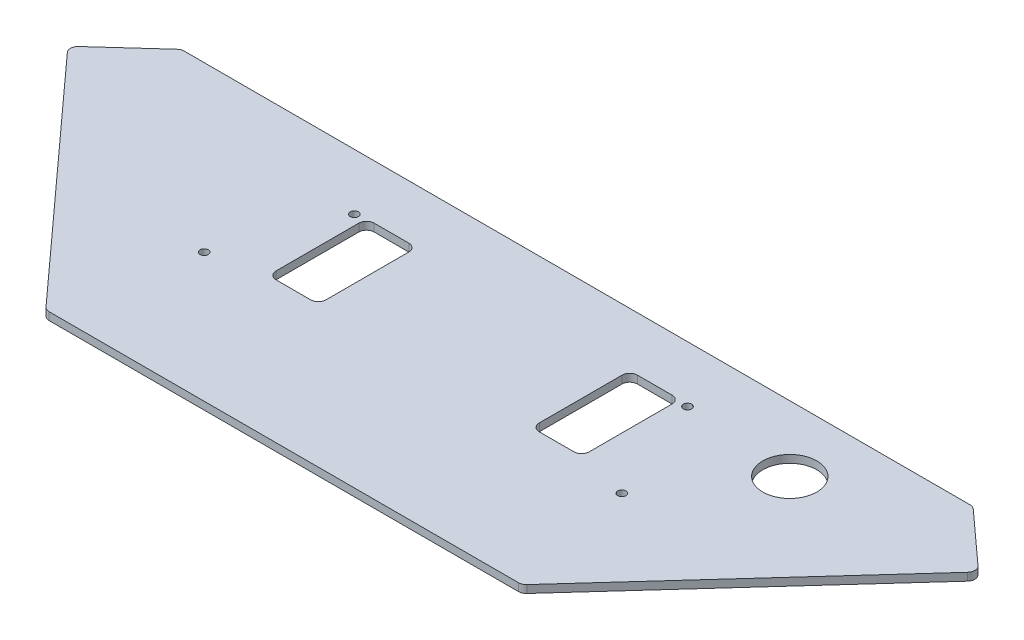
ISO-10303-21;
HEADER;
FILE_DESCRIPTION(('STEP AP214'),'2;1');
FILE_NAME('part.step','',(''),(''),'','','');
FILE_SCHEMA(('AUTOMOTIVE_DESIGN { 1 0 10303 214 1 1 1 1 }'));
ENDSEC;
DATA;
#1=APPLICATION_CONTEXT('core data for automotive mechanical design processes');
#2=APPLICATION_PROTOCOL_DEFINITION('international standard','automotive_design',2000,#1);
#3=PRODUCT_CONTEXT('',#1,'mechanical');
#4=PRODUCT('Part','Part','',(#3));
#5=PRODUCT_RELATED_PRODUCT_CATEGORY('part','',(#4));
#6=PRODUCT_DEFINITION_FORMATION('','',#4);
#7=PRODUCT_DEFINITION_CONTEXT('part definition',#1,'design');
#8=PRODUCT_DEFINITION('design','',#6,#7);
#9=PRODUCT_DEFINITION_SHAPE('','',#8);
#10=(LENGTH_UNIT() NAMED_UNIT(*) SI_UNIT(.MILLI.,.METRE.));
#11=(NAMED_UNIT(*) PLANE_ANGLE_UNIT() SI_UNIT($,.RADIAN.));
#12=(NAMED_UNIT(*) SI_UNIT($,.STERADIAN.) SOLID_ANGLE_UNIT());
#13=UNCERTAINTY_MEASURE_WITH_UNIT(LENGTH_MEASURE(1.E-05),#10,'distance_accuracy_value','');
#14=(GEOMETRIC_REPRESENTATION_CONTEXT(3) GLOBAL_UNCERTAINTY_ASSIGNED_CONTEXT((#13)) GLOBAL_UNIT_ASSIGNED_CONTEXT((#10,
#11,#12)) REPRESENTATION_CONTEXT('',''));
#15=CARTESIAN_POINT('',(0.,0.,0.));
#16=DIRECTION('',(0.,0.,1.));
#17=DIRECTION('',(1.,0.,0.));
#18=AXIS2_PLACEMENT_3D('',#15,#16,#17);
#19=CARTESIAN_POINT('',(-187.336709329558,3.175,-98.4569812393423));
#20=DIRECTION('',(0.740452782676817,0.,-0.672108381606834));
#21=DIRECTION('',(-0.672108381606834,0.,-0.740452782676817));
#22=AXIS2_PLACEMENT_3D('',#19,#20,#21);
#23=PLANE('',#22);
#24=DIRECTION('',(0.672108381606835,0.,0.740452782676817));
#25=VECTOR('',#24,1.);
#26=CARTESIAN_POINT('',(-187.336709329558,3.175,-98.4569812393423));
#27=LINE('',#26,#25);
#28=CARTESIAN_POINT('',(-185.202765217956,3.175,-96.1060436543434));
#29=VERTEX_POINT('',#28);
#30=CARTESIAN_POINT('',(-98.9123540402718,3.175,-1.04105588839828));
#31=VERTEX_POINT('',#30);
#32=EDGE_CURVE('E417',#29,#31,#27,.T.);
#33=ORIENTED_EDGE('',*,*,#32,.F.);
#34=DIRECTION('',(0.,-1.,0.));
#35=VECTOR('',#34,1.);
#36=CARTESIAN_POINT('',(-185.202765217956,3.175,-96.1060436543434));
#37=LINE('',#36,#35);
#38=CARTESIAN_POINT('',(-185.202765217956,0.,-96.1060436543434));
#39=VERTEX_POINT('',#38);
#40=EDGE_CURVE('E464',#29,#39,#37,.T.);
#41=ORIENTED_EDGE('',*,*,#40,.T.);
#42=DIRECTION('',(0.672108381606835,0.,0.740452782676817));
#43=VECTOR('',#42,1.);
#44=CARTESIAN_POINT('',(-187.336709329558,0.,-98.4569812393423));
#45=LINE('',#44,#43);
#46=CARTESIAN_POINT('',(-98.9123540402718,0.,-1.04105588839828));
#47=VERTEX_POINT('',#46);
#48=EDGE_CURVE('E312',#39,#47,#45,.T.);
#49=ORIENTED_EDGE('',*,*,#48,.T.);
#50=DIRECTION('',(0.,-1.,0.));
#51=VECTOR('',#50,1.);
#52=CARTESIAN_POINT('',(-98.9123540402718,3.175,-1.04105588839828));
#53=LINE('',#52,#51);
#54=EDGE_CURVE('E440',#47,#31,#53,.F.);
#55=ORIENTED_EDGE('',*,*,#54,.T.);
#56=EDGE_LOOP('',(#33,#41,#49,#55));
#57=FACE_BOUND('',#56,.T.);
#58=ADVANCED_FACE('F39',(#57),#23,.F.);
#59=CARTESIAN_POINT('',(-97.9673884669315,3.175,0.));
#60=DIRECTION('',(0.,0.,-1.));
#61=DIRECTION('',(-1.,0.,0.));
#62=AXIS2_PLACEMENT_3D('',#59,#60,#61);
#63=PLANE('',#62);
#64=DIRECTION('',(1.,0.,0.));
#65=VECTOR('',#64,1.);
#66=CARTESIAN_POINT('',(-97.9673884669315,0.,0.));
#67=LINE('',#66,#65);
#68=CARTESIAN_POINT('',(-96.5614164552729,0.,0.));
#69=VERTEX_POINT('',#68);
#70=CARTESIAN_POINT('',(96.5614164552729,0.,0.));
#71=VERTEX_POINT('',#70);
#72=EDGE_CURVE('E444',#69,#71,#67,.T.);
#73=ORIENTED_EDGE('',*,*,#72,.T.);
#74=DIRECTION('',(0.,-1.,0.));
#75=VECTOR('',#74,1.);
#76=CARTESIAN_POINT('',(96.5614164552729,3.175,0.));
#77=LINE('',#76,#75);
#78=CARTESIAN_POINT('',(96.5614164552729,3.175,0.));
#79=VERTEX_POINT('',#78);
#80=EDGE_CURVE('E11',#71,#79,#77,.F.);
#81=ORIENTED_EDGE('',*,*,#80,.T.);
#82=DIRECTION('',(1.,0.,0.));
#83=VECTOR('',#82,1.);
#84=CARTESIAN_POINT('',(-97.9673884669315,3.175,0.));
#85=LINE('',#84,#83);
#86=CARTESIAN_POINT('',(-96.5614164552729,3.175,0.));
#87=VERTEX_POINT('',#86);
#88=EDGE_CURVE('E421',#87,#79,#85,.T.);
#89=ORIENTED_EDGE('',*,*,#88,.F.);
#90=DIRECTION('',(0.,-1.,0.));
#91=VECTOR('',#90,1.);
#92=CARTESIAN_POINT('',(-96.5614164552729,3.175,0.));
#93=LINE('',#92,#91);
#94=EDGE_CURVE('E48',#87,#69,#93,.T.);
#95=ORIENTED_EDGE('',*,*,#94,.T.);
#96=EDGE_LOOP('',(#73,#81,#89,#95));
#97=FACE_BOUND('',#96,.T.);
#98=ADVANCED_FACE('F535',(#97),#63,.F.);
#99=CARTESIAN_POINT('',(97.9673884669315,3.175,0.));
#100=DIRECTION('',(-0.740452782676817,0.,-0.672108381606834));
#101=DIRECTION('',(-0.672108381606834,0.,0.740452782676817));
#102=AXIS2_PLACEMENT_3D('',#99,#100,#101);
#103=PLANE('',#102);
#104=DIRECTION('',(0.672108381606835,0.,-0.740452782676817));
#105=VECTOR('',#104,1.);
#106=CARTESIAN_POINT('',(97.9673884669315,0.,0.));
#107=LINE('',#106,#105);
#108=CARTESIAN_POINT('',(98.9123540402718,0.,-1.0410558883983));
#109=VERTEX_POINT('',#108);
#110=CARTESIAN_POINT('',(185.202765217956,0.,-96.1060436543434));
#111=VERTEX_POINT('',#110);
#112=EDGE_CURVE('E448',#109,#111,#107,.T.);
#113=ORIENTED_EDGE('',*,*,#112,.T.);
#114=DIRECTION('',(0.,-1.,0.));
#115=VECTOR('',#114,1.);
#116=CARTESIAN_POINT('',(185.202765217956,3.175,-96.1060436543434));
#117=LINE('',#116,#115);
#118=CARTESIAN_POINT('',(185.202765217956,3.175,-96.1060436543434));
#119=VERTEX_POINT('',#118);
#120=EDGE_CURVE('E527',#111,#119,#117,.F.);
#121=ORIENTED_EDGE('',*,*,#120,.T.);
#122=DIRECTION('',(0.672108381606835,0.,-0.740452782676817));
#123=VECTOR('',#122,1.);
#124=CARTESIAN_POINT('',(97.9673884669315,3.175,0.));
#125=LINE('',#124,#123);
#126=CARTESIAN_POINT('',(98.9123540402718,3.175,-1.0410558883983));
#127=VERTEX_POINT('',#126);
#128=EDGE_CURVE('E426',#127,#119,#125,.T.);
#129=ORIENTED_EDGE('',*,*,#128,.F.);
#130=DIRECTION('',(0.,-1.,0.));
#131=VECTOR('',#130,1.);
#132=CARTESIAN_POINT('',(98.9123540402718,3.175,-1.0410558883983));
#133=LINE('',#132,#131);
#134=EDGE_CURVE('E523',#127,#109,#133,.T.);
#135=ORIENTED_EDGE('',*,*,#134,.T.);
#136=EDGE_LOOP('',(#113,#121,#129,#135));
#137=FACE_BOUND('',#136,.T.);
#138=ADVANCED_FACE('F548',(#137),#103,.F.);
#139=CARTESIAN_POINT('',(187.336709329558,3.175,-98.4569812393423));
#140=DIRECTION('',(-0.672108381606835,0.,0.740452782676817));
#141=DIRECTION('',(0.740452782676817,0.,0.672108381606835));
#142=AXIS2_PLACEMENT_3D('',#139,#140,#141);
#143=PLANE('',#142);
#144=DIRECTION('',(-0.740452782676817,0.,-0.672108381606835));
#145=VECTOR('',#144,1.);
#146=CARTESIAN_POINT('',(187.336709329558,0.,-98.4569812393423));
#147=LINE('',#146,#145);
#148=CARTESIAN_POINT('',(184.985771744559,0.,-100.590925350944));
#149=VERTEX_POINT('',#148);
#150=CARTESIAN_POINT('',(163.794816947241,0.,-119.825937584999));
#151=VERTEX_POINT('',#150);
#152=EDGE_CURVE('E452',#149,#151,#147,.T.);
#153=ORIENTED_EDGE('',*,*,#152,.T.);
#154=DIRECTION('',(0.,-1.,0.));
#155=VECTOR('',#154,1.);
#156=CARTESIAN_POINT('',(163.794816947241,3.175,-119.825937584999));
#157=LINE('',#156,#155);
#158=CARTESIAN_POINT('',(163.794816947241,3.175,-119.825937584999));
#159=VERTEX_POINT('',#158);
#160=EDGE_CURVE('E520',#151,#159,#157,.F.);
#161=ORIENTED_EDGE('',*,*,#160,.T.);
#162=DIRECTION('',(-0.740452782676817,0.,-0.672108381606835));
#163=VECTOR('',#162,1.);
#164=CARTESIAN_POINT('',(187.336709329558,3.175,-98.4569812393423));
#165=LINE('',#164,#163);
#166=CARTESIAN_POINT('',(184.985771744559,3.175,-100.590925350944));
#167=VERTEX_POINT('',#166);
#168=EDGE_CURVE('E430',#167,#159,#165,.T.);
#169=ORIENTED_EDGE('',*,*,#168,.F.);
#170=DIRECTION('',(0.,-1.,0.));
#171=VECTOR('',#170,1.);
#172=CARTESIAN_POINT('',(184.985771744559,3.175,-100.590925350944));
#173=LINE('',#172,#171);
#174=EDGE_CURVE('E516',#167,#149,#173,.T.);
#175=ORIENTED_EDGE('',*,*,#174,.T.);
#176=EDGE_LOOP('',(#153,#161,#169,#175));
#177=FACE_BOUND('',#176,.T.);
#178=ADVANCED_FACE('F558',(#177),#143,.F.);
#179=CARTESIAN_POINT('',(162.886958445569,3.175,-120.65));
#180=DIRECTION('',(0.,0.,1.));
#181=DIRECTION('',(1.,0.,0.));
#182=AXIS2_PLACEMENT_3D('',#179,#180,#181);
#183=PLANE('',#182);
#184=DIRECTION('',(-1.,0.,0.));
#185=VECTOR('',#184,1.);
#186=CARTESIAN_POINT('',(162.886958445569,0.,-120.65));
#187=LINE('',#186,#185);
#188=CARTESIAN_POINT('',(161.66087283564,0.,-120.65));
#189=VERTEX_POINT('',#188);
#190=CARTESIAN_POINT('',(-161.66087283564,0.,-120.65));
#191=VERTEX_POINT('',#190);
#192=EDGE_CURVE('E456',#189,#191,#187,.T.);
#193=ORIENTED_EDGE('',*,*,#192,.T.);
#194=DIRECTION('',(0.,-1.,0.));
#195=VECTOR('',#194,1.);
#196=CARTESIAN_POINT('',(-161.66087283564,3.175,-120.65));
#197=LINE('',#196,#195);
#198=CARTESIAN_POINT('',(-161.66087283564,3.175,-120.65));
#199=VERTEX_POINT('',#198);
#200=EDGE_CURVE('E55',#191,#199,#197,.F.);
#201=ORIENTED_EDGE('',*,*,#200,.T.);
#202=DIRECTION('',(-1.,0.,0.));
#203=VECTOR('',#202,1.);
#204=CARTESIAN_POINT('',(162.886958445569,3.175,-120.65));
#205=LINE('',#204,#203);
#206=CARTESIAN_POINT('',(161.66087283564,3.175,-120.65));
#207=VERTEX_POINT('',#206);
#208=EDGE_CURVE('E433',#207,#199,#205,.T.);
#209=ORIENTED_EDGE('',*,*,#208,.F.);
#210=DIRECTION('',(0.,-1.,0.));
#211=VECTOR('',#210,1.);
#212=CARTESIAN_POINT('',(161.66087283564,3.175,-120.65));
#213=LINE('',#212,#211);
#214=EDGE_CURVE('E510',#207,#189,#213,.T.);
#215=ORIENTED_EDGE('',*,*,#214,.T.);
#216=EDGE_LOOP('',(#193,#201,#209,#215));
#217=FACE_BOUND('',#216,.T.);
#218=ADVANCED_FACE('F564',(#217),#183,.F.);
#219=CARTESIAN_POINT('',(-187.336709329558,3.175,-98.4569812393423));
#220=DIRECTION('',(0.672108381606835,0.,0.740452782676817));
#221=DIRECTION('',(0.740452782676817,0.,-0.672108381606835));
#222=AXIS2_PLACEMENT_3D('',#219,#220,#221);
#223=PLANE('',#222);
#224=DIRECTION('',(-0.740452782676817,0.,0.672108381606835));
#225=VECTOR('',#224,1.);
#226=CARTESIAN_POINT('',(-187.336709329558,0.,-98.4569812393423));
#227=LINE('',#226,#225);
#228=CARTESIAN_POINT('',(-163.794816947241,0.,-119.825937584999));
#229=VERTEX_POINT('',#228);
#230=CARTESIAN_POINT('',(-184.985771744559,0.,-100.590925350944));
#231=VERTEX_POINT('',#230);
#232=EDGE_CURVE('E422',#229,#231,#227,.T.);
#233=ORIENTED_EDGE('',*,*,#232,.T.);
#234=DIRECTION('',(0.,-1.,0.));
#235=VECTOR('',#234,1.);
#236=CARTESIAN_POINT('',(-184.985771744559,3.175,-100.590925350944));
#237=LINE('',#236,#235);
#238=CARTESIAN_POINT('',(-184.985771744559,3.175,-100.590925350944));
#239=VERTEX_POINT('',#238);
#240=EDGE_CURVE('E490',#231,#239,#237,.F.);
#241=ORIENTED_EDGE('',*,*,#240,.T.);
#242=DIRECTION('',(-0.740452782676817,0.,0.672108381606835));
#243=VECTOR('',#242,1.);
#244=CARTESIAN_POINT('',(-187.336709329558,3.175,-98.4569812393423));
#245=LINE('',#244,#243);
#246=CARTESIAN_POINT('',(-163.794816947241,3.175,-119.825937584999));
#247=VERTEX_POINT('',#246);
#248=EDGE_CURVE('E436',#247,#239,#245,.T.);
#249=ORIENTED_EDGE('',*,*,#248,.F.);
#250=DIRECTION('',(0.,-1.,0.));
#251=VECTOR('',#250,1.);
#252=CARTESIAN_POINT('',(-163.794816947241,3.175,-119.825937584999));
#253=LINE('',#252,#251);
#254=EDGE_CURVE('E486',#247,#229,#253,.T.);
#255=ORIENTED_EDGE('',*,*,#254,.T.);
#256=EDGE_LOOP('',(#233,#241,#249,#255));
#257=FACE_BOUND('',#256,.T.);
#258=ADVANCED_FACE('F572',(#257),#223,.F.);
#259=CARTESIAN_POINT('',(0.,3.175,0.));
#260=DIRECTION('',(0.,1.,0.));
#261=DIRECTION('',(0.,0.,1.));
#262=AXIS2_PLACEMENT_3D('',#259,#260,#261);
#263=PLANE('',#262);
#264=CARTESIAN_POINT('',(114.4778,3.175,-93.6625));
#265=DIRECTION('',(0.,1.,0.));
#266=DIRECTION('',(0.,0.,1.));
#267=AXIS2_PLACEMENT_3D('',#264,#265,#266);
#268=CIRCLE('',#267,11.1125);
#269=CARTESIAN_POINT('',(114.4778,3.175,-82.5499999999999));
#270=VERTEX_POINT('',#269);
#271=EDGE_CURVE('E915',#270,#270,#268,.T.);
#272=ORIENTED_EDGE('',*,*,#271,.F.);
#273=EDGE_LOOP('',(#272));
#274=FACE_BOUND('',#273,.T.);
#275=CARTESIAN_POINT('',(-68.5292,3.175,-97.5359999999999));
#276=DIRECTION('',(0.,1.,0.));
#277=DIRECTION('',(0.,0.,-1.));
#278=AXIS2_PLACEMENT_3D('',#275,#276,#277);
#279=CIRCLE('',#278,1.7018);
#280=CARTESIAN_POINT('',(-68.5292,3.175,-99.2378));
#281=VERTEX_POINT('',#280);
#282=EDGE_CURVE('E905',#281,#281,#279,.T.);
#283=ORIENTED_EDGE('',*,*,#282,.F.);
#284=EDGE_LOOP('',(#283));
#285=FACE_BOUND('',#284,.T.);
#286=CARTESIAN_POINT('',(-85.9282,3.175,-53.1114));
#287=DIRECTION('',(0.,1.,0.));
#288=DIRECTION('',(0.,0.,-1.));
#289=AXIS2_PLACEMENT_3D('',#286,#287,#288);
#290=CIRCLE('',#289,1.7018);
#291=CARTESIAN_POINT('',(-85.9282,3.175,-54.8132));
#292=VERTEX_POINT('',#291);
#293=EDGE_CURVE('E912',#292,#292,#290,.T.);
#294=ORIENTED_EDGE('',*,*,#293,.F.);
#295=EDGE_LOOP('',(#294));
#296=FACE_BOUND('',#295,.T.);
#297=CARTESIAN_POINT('',(85.9282,3.175,-53.1114));
#298=DIRECTION('',(0.,1.,0.));
#299=DIRECTION('',(0.,0.,1.));
#300=AXIS2_PLACEMENT_3D('',#297,#298,#299);
#301=CIRCLE('',#300,1.7018);
#302=CARTESIAN_POINT('',(85.9282,3.175,-51.4096));
#303=VERTEX_POINT('',#302);
#304=EDGE_CURVE('E930',#303,#303,#301,.T.);
#305=ORIENTED_EDGE('',*,*,#304,.F.);
#306=EDGE_LOOP('',(#305));
#307=FACE_BOUND('',#306,.T.);
#308=CARTESIAN_POINT('',(68.5292,3.175,-97.536));
#309=DIRECTION('',(0.,1.,0.));
#310=DIRECTION('',(0.,0.,1.));
#311=AXIS2_PLACEMENT_3D('',#308,#309,#310);
#312=CIRCLE('',#311,1.7018);
#313=CARTESIAN_POINT('',(68.5292,3.175,-95.8342));
#314=VERTEX_POINT('',#313);
#315=EDGE_CURVE('E920',#314,#314,#312,.T.);
#316=ORIENTED_EDGE('',*,*,#315,.F.);
#317=EDGE_LOOP('',(#316));
#318=FACE_BOUND('',#317,.T.);
#319=CARTESIAN_POINT('',(47.0408,3.175,-95.25));
#320=DIRECTION('',(0.,1.,0.));
#321=DIRECTION('',(0.,0.,-1.));
#322=AXIS2_PLACEMENT_3D('',#319,#320,#321);
#323=CIRCLE('',#322,3.175);
#324=CARTESIAN_POINT('',(47.0408,3.175,-98.425));
#325=VERTEX_POINT('',#324);
#326=CARTESIAN_POINT('',(43.8658,3.175,-95.25));
#327=VERTEX_POINT('',#326);
#328=EDGE_CURVE('E233',#325,#327,#323,.T.);
#329=ORIENTED_EDGE('',*,*,#328,.F.);
#330=DIRECTION('',(-1.,0.,0.));
#331=VECTOR('',#330,1.);
#332=CARTESIAN_POINT('',(61.2648,3.175,-98.425));
#333=LINE('',#332,#331);
#334=CARTESIAN_POINT('',(61.2648,3.175,-98.425));
#335=VERTEX_POINT('',#334);
#336=EDGE_CURVE('E255',#335,#325,#333,.T.);
#337=ORIENTED_EDGE('',*,*,#336,.F.);
#338=CARTESIAN_POINT('',(61.2648,3.175,-95.25));
#339=DIRECTION('',(0.,1.,0.));
#340=DIRECTION('',(0.,0.,-1.));
#341=AXIS2_PLACEMENT_3D('',#338,#339,#340);
#342=CIRCLE('',#341,3.175);
#343=CARTESIAN_POINT('',(64.4398,3.175,-95.25));
#344=VERTEX_POINT('',#343);
#345=EDGE_CURVE('E259',#344,#335,#342,.T.);
#346=ORIENTED_EDGE('',*,*,#345,.F.);
#347=DIRECTION('',(0.,0.,-1.));
#348=VECTOR('',#347,1.);
#349=CARTESIAN_POINT('',(64.4398,3.175,-61.214));
#350=LINE('',#349,#348);
#351=CARTESIAN_POINT('',(64.4398,3.175,-61.214));
#352=VERTEX_POINT('',#351);
#353=EDGE_CURVE('E302',#352,#344,#350,.T.);
#354=ORIENTED_EDGE('',*,*,#353,.F.);
#355=CARTESIAN_POINT('',(61.2648,3.175,-61.214));
#356=DIRECTION('',(0.,1.,0.));
#357=DIRECTION('',(0.,0.,-1.));
#358=AXIS2_PLACEMENT_3D('',#355,#356,#357);
#359=CIRCLE('',#358,3.175);
#360=CARTESIAN_POINT('',(61.2648,3.175,-58.039));
#361=VERTEX_POINT('',#360);
#362=EDGE_CURVE('E298',#361,#352,#359,.T.);
#363=ORIENTED_EDGE('',*,*,#362,.F.);
#364=DIRECTION('',(1.,0.,0.));
#365=VECTOR('',#364,1.);
#366=CARTESIAN_POINT('',(61.2648,3.175,-58.039));
#367=LINE('',#366,#365);
#368=CARTESIAN_POINT('',(47.0408,3.175,-58.039));
#369=VERTEX_POINT('',#368);
#370=EDGE_CURVE('E294',#369,#361,#367,.T.);
#371=ORIENTED_EDGE('',*,*,#370,.F.);
#372=CARTESIAN_POINT('',(47.0408,3.175,-61.214));
#373=DIRECTION('',(0.,1.,0.));
#374=DIRECTION('',(0.,0.,1.));
#375=AXIS2_PLACEMENT_3D('',#372,#373,#374);
#376=CIRCLE('',#375,3.175);
#377=CARTESIAN_POINT('',(43.8658,3.175,-61.214));
#378=VERTEX_POINT('',#377);
#379=EDGE_CURVE('E290',#378,#369,#376,.T.);
#380=ORIENTED_EDGE('',*,*,#379,.F.);
#381=DIRECTION('',(0.,0.,1.));
#382=VECTOR('',#381,1.);
#383=CARTESIAN_POINT('',(43.8658,3.175,-61.214));
#384=LINE('',#383,#382);
#385=EDGE_CURVE('E286',#327,#378,#384,.T.);
#386=ORIENTED_EDGE('',*,*,#385,.F.);
#387=EDGE_LOOP('',(#329,#337,#346,#354,#363,#371,#380,#386));
#388=FACE_BOUND('',#387,.T.);
#389=CARTESIAN_POINT('',(-61.2648,3.175,-61.214));
#390=DIRECTION('',(0.,1.,0.));
#391=DIRECTION('',(0.,0.,-1.));
#392=AXIS2_PLACEMENT_3D('',#389,#390,#391);
#393=CIRCLE('',#392,3.175);
#394=CARTESIAN_POINT('',(-64.4398,3.175,-61.214));
#395=VERTEX_POINT('',#394);
#396=CARTESIAN_POINT('',(-61.2648,3.175,-58.039));
#397=VERTEX_POINT('',#396);
#398=EDGE_CURVE('E364',#395,#397,#393,.T.);
#399=ORIENTED_EDGE('',*,*,#398,.F.);
#400=DIRECTION('',(0.,0.,1.));
#401=VECTOR('',#400,1.);
#402=CARTESIAN_POINT('',(-64.4398,3.175,-61.214));
#403=LINE('',#402,#401);
#404=CARTESIAN_POINT('',(-64.4398,3.175,-95.25));
#405=VERTEX_POINT('',#404);
#406=EDGE_CURVE('E335',#405,#395,#403,.T.);
#407=ORIENTED_EDGE('',*,*,#406,.F.);
#408=CARTESIAN_POINT('',(-61.2648,3.175,-95.25));
#409=DIRECTION('',(0.,1.,0.));
#410=DIRECTION('',(0.,0.,-1.));
#411=AXIS2_PLACEMENT_3D('',#408,#409,#410);
#412=CIRCLE('',#411,3.175);
#413=CARTESIAN_POINT('',(-61.2648,3.175,-98.425));
#414=VERTEX_POINT('',#413);
#415=EDGE_CURVE('E387',#414,#405,#412,.T.);
#416=ORIENTED_EDGE('',*,*,#415,.F.);
#417=DIRECTION('',(-1.,0.,0.));
#418=VECTOR('',#417,1.);
#419=CARTESIAN_POINT('',(-61.2648,3.175,-98.425));
#420=LINE('',#419,#418);
#421=CARTESIAN_POINT('',(-47.0408,3.175,-98.425));
#422=VERTEX_POINT('',#421);
#423=EDGE_CURVE('E383',#422,#414,#420,.T.);
#424=ORIENTED_EDGE('',*,*,#423,.F.);
#425=CARTESIAN_POINT('',(-47.0408,3.175,-95.25));
#426=DIRECTION('',(0.,1.,0.));
#427=DIRECTION('',(0.,0.,-1.));
#428=AXIS2_PLACEMENT_3D('',#425,#426,#427);
#429=CIRCLE('',#428,3.175);
#430=CARTESIAN_POINT('',(-43.8658,3.175,-95.25));
#431=VERTEX_POINT('',#430);
#432=EDGE_CURVE('E379',#431,#422,#429,.T.);
#433=ORIENTED_EDGE('',*,*,#432,.F.);
#434=DIRECTION('',(0.,0.,-1.));
#435=VECTOR('',#434,1.);
#436=CARTESIAN_POINT('',(-43.8658,3.175,-61.214));
#437=LINE('',#436,#435);
#438=CARTESIAN_POINT('',(-43.8658,3.175,-61.214));
#439=VERTEX_POINT('',#438);
#440=EDGE_CURVE('E375',#439,#431,#437,.T.);
#441=ORIENTED_EDGE('',*,*,#440,.F.);
#442=CARTESIAN_POINT('',(-47.0408,3.175,-61.214));
#443=DIRECTION('',(0.,1.,0.));
#444=DIRECTION('',(0.,0.,1.));
#445=AXIS2_PLACEMENT_3D('',#442,#443,#444);
#446=CIRCLE('',#445,3.175);
#447=CARTESIAN_POINT('',(-47.0408,3.175,-58.039));
#448=VERTEX_POINT('',#447);
#449=EDGE_CURVE('E371',#448,#439,#446,.T.);
#450=ORIENTED_EDGE('',*,*,#449,.F.);
#451=DIRECTION('',(1.,0.,0.));
#452=VECTOR('',#451,1.);
#453=CARTESIAN_POINT('',(-61.2648,3.175,-58.039));
#454=LINE('',#453,#452);
#455=EDGE_CURVE('E367',#397,#448,#454,.T.);
#456=ORIENTED_EDGE('',*,*,#455,.F.);
#457=EDGE_LOOP('',(#399,#407,#416,#424,#433,#441,#450,#456));
#458=FACE_BOUND('',#457,.T.);
#459=ORIENTED_EDGE('',*,*,#248,.T.);
#460=CARTESIAN_POINT('',(-182.851827632957,3.175,-98.2399877659451));
#461=DIRECTION('',(0.,1.,0.));
#462=DIRECTION('',(0.,0.,1.));
#463=AXIS2_PLACEMENT_3D('',#460,#461,#462);
#464=CIRCLE('',#463,3.175);
#465=EDGE_CURVE('E507',#239,#29,#464,.T.);
#466=ORIENTED_EDGE('',*,*,#465,.T.);
#467=ORIENTED_EDGE('',*,*,#32,.T.);
#468=CARTESIAN_POINT('',(-96.5614164552729,3.175,-3.175));
#469=DIRECTION('',(0.,1.,0.));
#470=DIRECTION('',(0.,0.,1.));
#471=AXIS2_PLACEMENT_3D('',#468,#469,#470);
#472=CIRCLE('',#471,3.175);
#473=EDGE_CURVE('E493',#31,#87,#472,.T.);
#474=ORIENTED_EDGE('',*,*,#473,.T.);
#475=ORIENTED_EDGE('',*,*,#88,.T.);
#476=CARTESIAN_POINT('',(96.5614164552729,3.175,-3.175));
#477=DIRECTION('',(0.,1.,0.));
#478=DIRECTION('',(0.,0.,1.));
#479=AXIS2_PLACEMENT_3D('',#476,#477,#478);
#480=CIRCLE('',#479,3.175);
#481=EDGE_CURVE('E496',#79,#127,#480,.T.);
#482=ORIENTED_EDGE('',*,*,#481,.T.);
#483=ORIENTED_EDGE('',*,*,#128,.T.);
#484=CARTESIAN_POINT('',(182.851827632957,3.175,-98.2399877659451));
#485=DIRECTION('',(0.,1.,0.));
#486=DIRECTION('',(0.,0.,1.));
#487=AXIS2_PLACEMENT_3D('',#484,#485,#486);
#488=CIRCLE('',#487,3.175);
#489=EDGE_CURVE('E499',#119,#167,#488,.T.);
#490=ORIENTED_EDGE('',*,*,#489,.T.);
#491=ORIENTED_EDGE('',*,*,#168,.T.);
#492=CARTESIAN_POINT('',(161.66087283564,3.175,-117.475));
#493=DIRECTION('',(0.,1.,0.));
#494=DIRECTION('',(0.,0.,1.));
#495=AXIS2_PLACEMENT_3D('',#492,#493,#494);
#496=CIRCLE('',#495,3.175);
#497=EDGE_CURVE('E62',#159,#207,#496,.T.);
#498=ORIENTED_EDGE('',*,*,#497,.T.);
#499=ORIENTED_EDGE('',*,*,#208,.T.);
#500=CARTESIAN_POINT('',(-161.66087283564,3.175,-117.475));
#501=DIRECTION('',(0.,1.,0.));
#502=DIRECTION('',(0.,0.,1.));
#503=AXIS2_PLACEMENT_3D('',#500,#501,#502);
#504=CIRCLE('',#503,3.175);
#505=EDGE_CURVE('E504',#199,#247,#504,.T.);
#506=ORIENTED_EDGE('',*,*,#505,.T.);
#507=EDGE_LOOP('',(#459,#466,#467,#474,#475,#482,#483,#490,#491,#498,#499,#506));
#508=FACE_BOUND('',#507,.T.);
#509=ADVANCED_FACE('F551',(#274,#285,#296,#307,#318,#388,#458,#508),#263,.T.);
#510=CARTESIAN_POINT('',(0.,0.,0.));
#511=DIRECTION('',(0.,1.,0.));
#512=DIRECTION('',(0.,0.,1.));
#513=AXIS2_PLACEMENT_3D('',#510,#511,#512);
#514=PLANE('',#513);
#515=CARTESIAN_POINT('',(114.4778,0.,-93.6625));
#516=DIRECTION('',(0.,1.,0.));
#517=DIRECTION('',(0.,0.,1.));
#518=AXIS2_PLACEMENT_3D('',#515,#516,#517);
#519=CIRCLE('',#518,11.1125);
#520=CARTESIAN_POINT('',(114.4778,0.,-82.5499999999999));
#521=VERTEX_POINT('',#520);
#522=EDGE_CURVE('E908',#521,#521,#519,.T.);
#523=ORIENTED_EDGE('',*,*,#522,.T.);
#524=EDGE_LOOP('',(#523));
#525=FACE_BOUND('',#524,.T.);
#526=CARTESIAN_POINT('',(-68.5292,0.,-97.5359999999999));
#527=DIRECTION('',(0.,1.,0.));
#528=DIRECTION('',(0.,0.,1.));
#529=AXIS2_PLACEMENT_3D('',#526,#527,#528);
#530=CIRCLE('',#529,1.7018);
#531=CARTESIAN_POINT('',(-68.5292,0.,-95.8341999999999));
#532=VERTEX_POINT('',#531);
#533=EDGE_CURVE('E902',#532,#532,#530,.F.);
#534=ORIENTED_EDGE('',*,*,#533,.F.);
#535=EDGE_LOOP('',(#534));
#536=FACE_BOUND('',#535,.T.);
#537=CARTESIAN_POINT('',(-85.9282,0.,-53.1114));
#538=DIRECTION('',(0.,1.,0.));
#539=DIRECTION('',(0.,0.,1.));
#540=AXIS2_PLACEMENT_3D('',#537,#538,#539);
#541=CIRCLE('',#540,1.7018);
#542=CARTESIAN_POINT('',(-85.9282,0.,-51.4096));
#543=VERTEX_POINT('',#542);
#544=EDGE_CURVE('E918',#543,#543,#541,.F.);
#545=ORIENTED_EDGE('',*,*,#544,.F.);
#546=EDGE_LOOP('',(#545));
#547=FACE_BOUND('',#546,.T.);
#548=CARTESIAN_POINT('',(85.9282,0.,-53.1114));
#549=DIRECTION('',(0.,1.,0.));
#550=DIRECTION('',(0.,0.,1.));
#551=AXIS2_PLACEMENT_3D('',#548,#549,#550);
#552=CIRCLE('',#551,1.7018);
#553=CARTESIAN_POINT('',(85.9282,0.,-51.4096));
#554=VERTEX_POINT('',#553);
#555=EDGE_CURVE('E923',#554,#554,#552,.F.);
#556=ORIENTED_EDGE('',*,*,#555,.F.);
#557=EDGE_LOOP('',(#556));
#558=FACE_BOUND('',#557,.T.);
#559=CARTESIAN_POINT('',(68.5292,0.,-97.536));
#560=DIRECTION('',(0.,1.,0.));
#561=DIRECTION('',(0.,0.,1.));
#562=AXIS2_PLACEMENT_3D('',#559,#560,#561);
#563=CIRCLE('',#562,1.7018);
#564=CARTESIAN_POINT('',(68.5292,0.,-95.8342));
#565=VERTEX_POINT('',#564);
#566=EDGE_CURVE('E262',#565,#565,#563,.F.);
#567=ORIENTED_EDGE('',*,*,#566,.F.);
#568=EDGE_LOOP('',(#567));
#569=FACE_BOUND('',#568,.T.);
#570=DIRECTION('',(-1.,0.,0.));
#571=VECTOR('',#570,1.);
#572=CARTESIAN_POINT('',(61.2648,0.,-98.425));
#573=LINE('',#572,#571);
#574=CARTESIAN_POINT('',(61.2648,0.,-98.425));
#575=VERTEX_POINT('',#574);
#576=CARTESIAN_POINT('',(47.0408,0.,-98.425));
#577=VERTEX_POINT('',#576);
#578=EDGE_CURVE('E239',#575,#577,#573,.T.);
#579=ORIENTED_EDGE('',*,*,#578,.T.);
#580=CARTESIAN_POINT('',(47.0408,0.,-95.25));
#581=DIRECTION('',(0.,1.,0.));
#582=DIRECTION('',(0.,0.,-1.));
#583=AXIS2_PLACEMENT_3D('',#580,#581,#582);
#584=CIRCLE('',#583,3.175);
#585=CARTESIAN_POINT('',(43.8658,0.,-95.25));
#586=VERTEX_POINT('',#585);
#587=EDGE_CURVE('E230',#577,#586,#584,.T.);
#588=ORIENTED_EDGE('',*,*,#587,.T.);
#589=DIRECTION('',(0.,0.,1.));
#590=VECTOR('',#589,1.);
#591=CARTESIAN_POINT('',(43.8658,0.,-61.214));
#592=LINE('',#591,#590);
#593=CARTESIAN_POINT('',(43.8658,0.,-61.214));
#594=VERTEX_POINT('',#593);
#595=EDGE_CURVE('E243',#586,#594,#592,.T.);
#596=ORIENTED_EDGE('',*,*,#595,.T.);
#597=CARTESIAN_POINT('',(47.0408,0.,-61.214));
#598=DIRECTION('',(0.,1.,0.));
#599=DIRECTION('',(0.,0.,1.));
#600=AXIS2_PLACEMENT_3D('',#597,#598,#599);
#601=CIRCLE('',#600,3.175);
#602=CARTESIAN_POINT('',(47.0408,0.,-58.039));
#603=VERTEX_POINT('',#602);
#604=EDGE_CURVE('E248',#594,#603,#601,.T.);
#605=ORIENTED_EDGE('',*,*,#604,.T.);
#606=DIRECTION('',(1.,0.,0.));
#607=VECTOR('',#606,1.);
#608=CARTESIAN_POINT('',(61.2648,0.,-58.039));
#609=LINE('',#608,#607);
#610=CARTESIAN_POINT('',(61.2648,0.,-58.039));
#611=VERTEX_POINT('',#610);
#612=EDGE_CURVE('E267',#603,#611,#609,.T.);
#613=ORIENTED_EDGE('',*,*,#612,.T.);
#614=CARTESIAN_POINT('',(61.2648,0.,-61.214));
#615=DIRECTION('',(0.,1.,0.));
#616=DIRECTION('',(0.,0.,-1.));
#617=AXIS2_PLACEMENT_3D('',#614,#615,#616);
#618=CIRCLE('',#617,3.175);
#619=CARTESIAN_POINT('',(64.4398,0.,-61.214));
#620=VERTEX_POINT('',#619);
#621=EDGE_CURVE('E271',#611,#620,#618,.T.);
#622=ORIENTED_EDGE('',*,*,#621,.T.);
#623=DIRECTION('',(0.,0.,-1.));
#624=VECTOR('',#623,1.);
#625=CARTESIAN_POINT('',(64.4398,0.,-61.214));
#626=LINE('',#625,#624);
#627=CARTESIAN_POINT('',(64.4398,0.,-95.25));
#628=VERTEX_POINT('',#627);
#629=EDGE_CURVE('E275',#620,#628,#626,.T.);
#630=ORIENTED_EDGE('',*,*,#629,.T.);
#631=CARTESIAN_POINT('',(61.2648,0.,-95.25));
#632=DIRECTION('',(0.,1.,0.));
#633=DIRECTION('',(0.,0.,-1.));
#634=AXIS2_PLACEMENT_3D('',#631,#632,#633);
#635=CIRCLE('',#634,3.175);
#636=EDGE_CURVE('E279',#628,#575,#635,.T.);
#637=ORIENTED_EDGE('',*,*,#636,.T.);
#638=EDGE_LOOP('',(#579,#588,#596,#605,#613,#622,#630,#637));
#639=FACE_BOUND('',#638,.T.);
#640=DIRECTION('',(0.,0.,1.));
#641=VECTOR('',#640,1.);
#642=CARTESIAN_POINT('',(-64.4398,0.,-61.214));
#643=LINE('',#642,#641);
#644=CARTESIAN_POINT('',(-64.4398,0.,-95.25));
#645=VERTEX_POINT('',#644);
#646=CARTESIAN_POINT('',(-64.4398,0.,-61.214));
#647=VERTEX_POINT('',#646);
#648=EDGE_CURVE('E359',#645,#647,#643,.T.);
#649=ORIENTED_EDGE('',*,*,#648,.T.);
#650=CARTESIAN_POINT('',(-61.2648,0.,-61.214));
#651=DIRECTION('',(0.,1.,0.));
#652=DIRECTION('',(0.,0.,-1.));
#653=AXIS2_PLACEMENT_3D('',#650,#651,#652);
#654=CIRCLE('',#653,3.175);
#655=CARTESIAN_POINT('',(-61.2648,0.,-58.039));
#656=VERTEX_POINT('',#655);
#657=EDGE_CURVE('E330',#647,#656,#654,.T.);
#658=ORIENTED_EDGE('',*,*,#657,.T.);
#659=DIRECTION('',(1.,0.,0.));
#660=VECTOR('',#659,1.);
#661=CARTESIAN_POINT('',(-61.2648,0.,-58.039));
#662=LINE('',#661,#660);
#663=CARTESIAN_POINT('',(-47.0408,0.,-58.039));
#664=VERTEX_POINT('',#663);
#665=EDGE_CURVE('E334',#656,#664,#662,.T.);
#666=ORIENTED_EDGE('',*,*,#665,.T.);
#667=CARTESIAN_POINT('',(-47.0408,0.,-61.214));
#668=DIRECTION('',(0.,1.,0.));
#669=DIRECTION('',(0.,0.,1.));
#670=AXIS2_PLACEMENT_3D('',#667,#668,#669);
#671=CIRCLE('',#670,3.175);
#672=CARTESIAN_POINT('',(-43.8658,0.,-61.214));
#673=VERTEX_POINT('',#672);
#674=EDGE_CURVE('E339',#664,#673,#671,.T.);
#675=ORIENTED_EDGE('',*,*,#674,.T.);
#676=DIRECTION('',(0.,0.,-1.));
#677=VECTOR('',#676,1.);
#678=CARTESIAN_POINT('',(-43.8658,0.,-61.214));
#679=LINE('',#678,#677);
#680=CARTESIAN_POINT('',(-43.8658,0.,-95.25));
#681=VERTEX_POINT('',#680);
#682=EDGE_CURVE('E343',#673,#681,#679,.T.);
#683=ORIENTED_EDGE('',*,*,#682,.T.);
#684=CARTESIAN_POINT('',(-47.0408,0.,-95.25));
#685=DIRECTION('',(0.,1.,0.));
#686=DIRECTION('',(0.,0.,-1.));
#687=AXIS2_PLACEMENT_3D('',#684,#685,#686);
#688=CIRCLE('',#687,3.175);
#689=CARTESIAN_POINT('',(-47.0408,0.,-98.425));
#690=VERTEX_POINT('',#689);
#691=EDGE_CURVE('E347',#681,#690,#688,.T.);
#692=ORIENTED_EDGE('',*,*,#691,.T.);
#693=DIRECTION('',(-1.,0.,0.));
#694=VECTOR('',#693,1.);
#695=CARTESIAN_POINT('',(-61.2648,0.,-98.425));
#696=LINE('',#695,#694);
#697=CARTESIAN_POINT('',(-61.2648,0.,-98.425));
#698=VERTEX_POINT('',#697);
#699=EDGE_CURVE('E351',#690,#698,#696,.T.);
#700=ORIENTED_EDGE('',*,*,#699,.T.);
#701=CARTESIAN_POINT('',(-61.2648,0.,-95.25));
#702=DIRECTION('',(0.,1.,0.));
#703=DIRECTION('',(0.,0.,-1.));
#704=AXIS2_PLACEMENT_3D('',#701,#702,#703);
#705=CIRCLE('',#704,3.175);
#706=EDGE_CURVE('E355',#698,#645,#705,.T.);
#707=ORIENTED_EDGE('',*,*,#706,.T.);
#708=EDGE_LOOP('',(#649,#658,#666,#675,#683,#692,#700,#707));
#709=FACE_BOUND('',#708,.T.);
#710=ORIENTED_EDGE('',*,*,#48,.F.);
#711=CARTESIAN_POINT('',(-182.851827632957,0.,-98.2399877659451));
#712=DIRECTION('',(0.,1.,0.));
#713=DIRECTION('',(0.,0.,1.));
#714=AXIS2_PLACEMENT_3D('',#711,#712,#713);
#715=CIRCLE('',#714,3.175);
#716=EDGE_CURVE('E483',#39,#231,#715,.F.);
#717=ORIENTED_EDGE('',*,*,#716,.T.);
#718=ORIENTED_EDGE('',*,*,#232,.F.);
#719=CARTESIAN_POINT('',(-161.66087283564,0.,-117.475));
#720=DIRECTION('',(0.,1.,0.));
#721=DIRECTION('',(0.,0.,1.));
#722=AXIS2_PLACEMENT_3D('',#719,#720,#721);
#723=CIRCLE('',#722,3.175);
#724=EDGE_CURVE('E480',#229,#191,#723,.F.);
#725=ORIENTED_EDGE('',*,*,#724,.T.);
#726=ORIENTED_EDGE('',*,*,#192,.F.);
#727=CARTESIAN_POINT('',(161.66087283564,0.,-117.475));
#728=DIRECTION('',(0.,1.,0.));
#729=DIRECTION('',(0.,0.,1.));
#730=AXIS2_PLACEMENT_3D('',#727,#728,#729);
#731=CIRCLE('',#730,3.175);
#732=EDGE_CURVE('E477',#189,#151,#731,.F.);
#733=ORIENTED_EDGE('',*,*,#732,.T.);
#734=ORIENTED_EDGE('',*,*,#152,.F.);
#735=CARTESIAN_POINT('',(182.851827632957,0.,-98.2399877659451));
#736=DIRECTION('',(0.,1.,0.));
#737=DIRECTION('',(0.,0.,1.));
#738=AXIS2_PLACEMENT_3D('',#735,#736,#737);
#739=CIRCLE('',#738,3.175);
#740=EDGE_CURVE('E474',#149,#111,#739,.F.);
#741=ORIENTED_EDGE('',*,*,#740,.T.);
#742=ORIENTED_EDGE('',*,*,#112,.F.);
#743=CARTESIAN_POINT('',(96.5614164552729,0.,-3.175));
#744=DIRECTION('',(0.,1.,0.));
#745=DIRECTION('',(0.,0.,1.));
#746=AXIS2_PLACEMENT_3D('',#743,#744,#745);
#747=CIRCLE('',#746,3.175);
#748=EDGE_CURVE('E471',#109,#71,#747,.F.);
#749=ORIENTED_EDGE('',*,*,#748,.T.);
#750=ORIENTED_EDGE('',*,*,#72,.F.);
#751=CARTESIAN_POINT('',(-96.5614164552729,0.,-3.175));
#752=DIRECTION('',(0.,1.,0.));
#753=DIRECTION('',(0.,0.,1.));
#754=AXIS2_PLACEMENT_3D('',#751,#752,#753);
#755=CIRCLE('',#754,3.175);
#756=EDGE_CURVE('E468',#69,#47,#755,.F.);
#757=ORIENTED_EDGE('',*,*,#756,.T.);
#758=EDGE_LOOP('',(#710,#717,#718,#725,#726,#733,#734,#741,#742,#749,#750,#757));
#759=FACE_BOUND('',#758,.T.);
#760=ADVANCED_FACE('F250',(#525,#536,#547,#558,#569,#639,#709,#759),#514,.F.);
#761=CARTESIAN_POINT('',(-61.2648,0.,-61.214));
#762=DIRECTION('',(0.,1.,0.));
#763=DIRECTION('',(0.,0.,1.));
#764=AXIS2_PLACEMENT_3D('',#761,#762,#763);
#765=CYLINDRICAL_SURFACE('',#764,3.175);
#766=ORIENTED_EDGE('',*,*,#398,.T.);
#767=DIRECTION('',(0.,1.,0.));
#768=VECTOR('',#767,1.);
#769=CARTESIAN_POINT('',(-61.2648,0.,-58.039));
#770=LINE('',#769,#768);
#771=EDGE_CURVE('E363',#656,#397,#770,.T.);
#772=ORIENTED_EDGE('',*,*,#771,.F.);
#773=ORIENTED_EDGE('',*,*,#657,.F.);
#774=DIRECTION('',(0.,1.,0.));
#775=VECTOR('',#774,1.);
#776=CARTESIAN_POINT('',(-64.4398,0.,-61.214));
#777=LINE('',#776,#775);
#778=EDGE_CURVE('E287',#647,#395,#777,.T.);
#779=ORIENTED_EDGE('',*,*,#778,.T.);
#780=EDGE_LOOP('',(#766,#772,#773,#779));
#781=FACE_BOUND('',#780,.T.);
#782=ADVANCED_FACE('F638',(#781),#765,.F.);
#783=CARTESIAN_POINT('',(-64.4398,0.,-61.214));
#784=DIRECTION('',(-1.,0.,0.));
#785=DIRECTION('',(0.,0.,1.));
#786=AXIS2_PLACEMENT_3D('',#783,#784,#785);
#787=PLANE('',#786);
#788=ORIENTED_EDGE('',*,*,#406,.T.);
#789=ORIENTED_EDGE('',*,*,#778,.F.);
#790=ORIENTED_EDGE('',*,*,#648,.F.);
#791=DIRECTION('',(0.,1.,0.));
#792=VECTOR('',#791,1.);
#793=CARTESIAN_POINT('',(-64.4398,0.,-95.25));
#794=LINE('',#793,#792);
#795=EDGE_CURVE('E396',#645,#405,#794,.T.);
#796=ORIENTED_EDGE('',*,*,#795,.T.);
#797=EDGE_LOOP('',(#788,#789,#790,#796));
#798=FACE_BOUND('',#797,.T.);
#799=ADVANCED_FACE('F653',(#798),#787,.F.);
#800=CARTESIAN_POINT('',(-61.2648,0.,-95.25));
#801=DIRECTION('',(0.,1.,0.));
#802=DIRECTION('',(0.,0.,1.));
#803=AXIS2_PLACEMENT_3D('',#800,#801,#802);
#804=CYLINDRICAL_SURFACE('',#803,3.175);
#805=ORIENTED_EDGE('',*,*,#415,.T.);
#806=ORIENTED_EDGE('',*,*,#795,.F.);
#807=ORIENTED_EDGE('',*,*,#706,.F.);
#808=DIRECTION('',(0.,1.,0.));
#809=VECTOR('',#808,1.);
#810=CARTESIAN_POINT('',(-61.2648,0.,-98.425));
#811=LINE('',#810,#809);
#812=EDGE_CURVE('E399',#698,#414,#811,.T.);
#813=ORIENTED_EDGE('',*,*,#812,.T.);
#814=EDGE_LOOP('',(#805,#806,#807,#813));
#815=FACE_BOUND('',#814,.T.);
#816=ADVANCED_FACE('F660',(#815),#804,.F.);
#817=CARTESIAN_POINT('',(-61.2648,0.,-98.425));
#818=DIRECTION('',(0.,0.,-1.));
#819=DIRECTION('',(-1.,0.,0.));
#820=AXIS2_PLACEMENT_3D('',#817,#818,#819);
#821=PLANE('',#820);
#822=ORIENTED_EDGE('',*,*,#423,.T.);
#823=ORIENTED_EDGE('',*,*,#812,.F.);
#824=ORIENTED_EDGE('',*,*,#699,.F.);
#825=DIRECTION('',(0.,1.,0.));
#826=VECTOR('',#825,1.);
#827=CARTESIAN_POINT('',(-47.0408,0.,-98.425));
#828=LINE('',#827,#826);
#829=EDGE_CURVE('E402',#690,#422,#828,.T.);
#830=ORIENTED_EDGE('',*,*,#829,.T.);
#831=EDGE_LOOP('',(#822,#823,#824,#830));
#832=FACE_BOUND('',#831,.T.);
#833=ADVANCED_FACE('F668',(#832),#821,.F.);
#834=CARTESIAN_POINT('',(-47.0408,0.,-95.25));
#835=DIRECTION('',(0.,1.,0.));
#836=DIRECTION('',(0.,0.,1.));
#837=AXIS2_PLACEMENT_3D('',#834,#835,#836);
#838=CYLINDRICAL_SURFACE('',#837,3.175);
#839=ORIENTED_EDGE('',*,*,#432,.T.);
#840=ORIENTED_EDGE('',*,*,#829,.F.);
#841=ORIENTED_EDGE('',*,*,#691,.F.);
#842=DIRECTION('',(0.,1.,0.));
#843=VECTOR('',#842,1.);
#844=CARTESIAN_POINT('',(-43.8658,0.,-95.25));
#845=LINE('',#844,#843);
#846=EDGE_CURVE('E405',#681,#431,#845,.T.);
#847=ORIENTED_EDGE('',*,*,#846,.T.);
#848=EDGE_LOOP('',(#839,#840,#841,#847));
#849=FACE_BOUND('',#848,.T.);
#850=ADVANCED_FACE('F676',(#849),#838,.F.);
#851=CARTESIAN_POINT('',(-43.8658,0.,-61.214));
#852=DIRECTION('',(1.,0.,0.));
#853=DIRECTION('',(0.,0.,-1.));
#854=AXIS2_PLACEMENT_3D('',#851,#852,#853);
#855=PLANE('',#854);
#856=ORIENTED_EDGE('',*,*,#440,.T.);
#857=ORIENTED_EDGE('',*,*,#846,.F.);
#858=ORIENTED_EDGE('',*,*,#682,.F.);
#859=DIRECTION('',(0.,1.,0.));
#860=VECTOR('',#859,1.);
#861=CARTESIAN_POINT('',(-43.8658,0.,-61.214));
#862=LINE('',#861,#860);
#863=EDGE_CURVE('E408',#673,#439,#862,.T.);
#864=ORIENTED_EDGE('',*,*,#863,.T.);
#865=EDGE_LOOP('',(#856,#857,#858,#864));
#866=FACE_BOUND('',#865,.T.);
#867=ADVANCED_FACE('F684',(#866),#855,.F.);
#868=CARTESIAN_POINT('',(-47.0408,0.,-61.214));
#869=DIRECTION('',(0.,1.,0.));
#870=DIRECTION('',(0.,0.,1.));
#871=AXIS2_PLACEMENT_3D('',#868,#869,#870);
#872=CYLINDRICAL_SURFACE('',#871,3.175);
#873=ORIENTED_EDGE('',*,*,#449,.T.);
#874=ORIENTED_EDGE('',*,*,#863,.F.);
#875=ORIENTED_EDGE('',*,*,#674,.F.);
#876=DIRECTION('',(0.,1.,0.));
#877=VECTOR('',#876,1.);
#878=CARTESIAN_POINT('',(-47.0408,0.,-58.039));
#879=LINE('',#878,#877);
#880=EDGE_CURVE('E411',#664,#448,#879,.T.);
#881=ORIENTED_EDGE('',*,*,#880,.T.);
#882=EDGE_LOOP('',(#873,#874,#875,#881));
#883=FACE_BOUND('',#882,.T.);
#884=ADVANCED_FACE('F692',(#883),#872,.F.);
#885=CARTESIAN_POINT('',(-61.2648,0.,-58.039));
#886=DIRECTION('',(0.,0.,1.));
#887=DIRECTION('',(1.,0.,0.));
#888=AXIS2_PLACEMENT_3D('',#885,#886,#887);
#889=PLANE('',#888);
#890=ORIENTED_EDGE('',*,*,#455,.T.);
#891=ORIENTED_EDGE('',*,*,#880,.F.);
#892=ORIENTED_EDGE('',*,*,#665,.F.);
#893=ORIENTED_EDGE('',*,*,#771,.T.);
#894=EDGE_LOOP('',(#890,#891,#892,#893));
#895=FACE_BOUND('',#894,.T.);
#896=ADVANCED_FACE('F700',(#895),#889,.F.);
#897=CARTESIAN_POINT('',(47.0408,0.,-95.25));
#898=DIRECTION('',(0.,1.,0.));
#899=DIRECTION('',(0.,0.,1.));
#900=AXIS2_PLACEMENT_3D('',#897,#898,#899);
#901=CYLINDRICAL_SURFACE('',#900,3.175);
#902=ORIENTED_EDGE('',*,*,#328,.T.);
#903=DIRECTION('',(0.,1.,0.));
#904=VECTOR('',#903,1.);
#905=CARTESIAN_POINT('',(43.8658,0.,-95.25));
#906=LINE('',#905,#904);
#907=EDGE_CURVE('E226',#586,#327,#906,.T.);
#908=ORIENTED_EDGE('',*,*,#907,.F.);
#909=ORIENTED_EDGE('',*,*,#587,.F.);
#910=DIRECTION('',(0.,1.,0.));
#911=VECTOR('',#910,1.);
#912=CARTESIAN_POINT('',(47.0408,0.,-98.425));
#913=LINE('',#912,#911);
#914=EDGE_CURVE('E309',#577,#325,#913,.T.);
#915=ORIENTED_EDGE('',*,*,#914,.T.);
#916=EDGE_LOOP('',(#902,#908,#909,#915));
#917=FACE_BOUND('',#916,.T.);
#918=ADVANCED_FACE('F228',(#917),#901,.F.);
#919=CARTESIAN_POINT('',(61.2648,0.,-98.425));
#920=DIRECTION('',(0.,0.,-1.));
#921=DIRECTION('',(-1.,0.,0.));
#922=AXIS2_PLACEMENT_3D('',#919,#920,#921);
#923=PLANE('',#922);
#924=ORIENTED_EDGE('',*,*,#336,.T.);
#925=ORIENTED_EDGE('',*,*,#914,.F.);
#926=ORIENTED_EDGE('',*,*,#578,.F.);
#927=DIRECTION('',(0.,1.,0.));
#928=VECTOR('',#927,1.);
#929=CARTESIAN_POINT('',(61.2648,0.,-98.425));
#930=LINE('',#929,#928);
#931=EDGE_CURVE('E313',#575,#335,#930,.T.);
#932=ORIENTED_EDGE('',*,*,#931,.T.);
#933=EDGE_LOOP('',(#924,#925,#926,#932));
#934=FACE_BOUND('',#933,.T.);
#935=ADVANCED_FACE('F715',(#934),#923,.F.);
#936=CARTESIAN_POINT('',(61.2648,0.,-95.25));
#937=DIRECTION('',(0.,1.,0.));
#938=DIRECTION('',(0.,0.,1.));
#939=AXIS2_PLACEMENT_3D('',#936,#937,#938);
#940=CYLINDRICAL_SURFACE('',#939,3.175);
#941=ORIENTED_EDGE('',*,*,#345,.T.);
#942=ORIENTED_EDGE('',*,*,#931,.F.);
#943=ORIENTED_EDGE('',*,*,#636,.F.);
#944=DIRECTION('',(0.,1.,0.));
#945=VECTOR('',#944,1.);
#946=CARTESIAN_POINT('',(64.4398,0.,-95.25));
#947=LINE('',#946,#945);
#948=EDGE_CURVE('E316',#628,#344,#947,.T.);
#949=ORIENTED_EDGE('',*,*,#948,.T.);
#950=EDGE_LOOP('',(#941,#942,#943,#949));
#951=FACE_BOUND('',#950,.T.);
#952=ADVANCED_FACE('F722',(#951),#940,.F.);
#953=CARTESIAN_POINT('',(64.4398,0.,-61.214));
#954=DIRECTION('',(1.,0.,0.));
#955=DIRECTION('',(0.,0.,-1.));
#956=AXIS2_PLACEMENT_3D('',#953,#954,#955);
#957=PLANE('',#956);
#958=ORIENTED_EDGE('',*,*,#353,.T.);
#959=ORIENTED_EDGE('',*,*,#948,.F.);
#960=ORIENTED_EDGE('',*,*,#629,.F.);
#961=DIRECTION('',(0.,1.,0.));
#962=VECTOR('',#961,1.);
#963=CARTESIAN_POINT('',(64.4398,0.,-61.214));
#964=LINE('',#963,#962);
#965=EDGE_CURVE('E319',#620,#352,#964,.T.);
#966=ORIENTED_EDGE('',*,*,#965,.T.);
#967=EDGE_LOOP('',(#958,#959,#960,#966));
#968=FACE_BOUND('',#967,.T.);
#969=ADVANCED_FACE('F730',(#968),#957,.F.);
#970=CARTESIAN_POINT('',(61.2648,0.,-61.214));
#971=DIRECTION('',(0.,1.,0.));
#972=DIRECTION('',(0.,0.,1.));
#973=AXIS2_PLACEMENT_3D('',#970,#971,#972);
#974=CYLINDRICAL_SURFACE('',#973,3.175);
#975=ORIENTED_EDGE('',*,*,#362,.T.);
#976=ORIENTED_EDGE('',*,*,#965,.F.);
#977=ORIENTED_EDGE('',*,*,#621,.F.);
#978=DIRECTION('',(0.,1.,0.));
#979=VECTOR('',#978,1.);
#980=CARTESIAN_POINT('',(61.2648,0.,-58.039));
#981=LINE('',#980,#979);
#982=EDGE_CURVE('E322',#611,#361,#981,.T.);
#983=ORIENTED_EDGE('',*,*,#982,.T.);
#984=EDGE_LOOP('',(#975,#976,#977,#983));
#985=FACE_BOUND('',#984,.T.);
#986=ADVANCED_FACE('F738',(#985),#974,.F.);
#987=CARTESIAN_POINT('',(61.2648,0.,-58.039));
#988=DIRECTION('',(0.,0.,1.));
#989=DIRECTION('',(1.,0.,0.));
#990=AXIS2_PLACEMENT_3D('',#987,#988,#989);
#991=PLANE('',#990);
#992=ORIENTED_EDGE('',*,*,#370,.T.);
#993=ORIENTED_EDGE('',*,*,#982,.F.);
#994=ORIENTED_EDGE('',*,*,#612,.F.);
#995=DIRECTION('',(0.,1.,0.));
#996=VECTOR('',#995,1.);
#997=CARTESIAN_POINT('',(47.0408,0.,-58.039));
#998=LINE('',#997,#996);
#999=EDGE_CURVE('E325',#603,#369,#998,.T.);
#1000=ORIENTED_EDGE('',*,*,#999,.T.);
#1001=EDGE_LOOP('',(#992,#993,#994,#1000));
#1002=FACE_BOUND('',#1001,.T.);
#1003=ADVANCED_FACE('F746',(#1002),#991,.F.);
#1004=CARTESIAN_POINT('',(47.0408,0.,-61.214));
#1005=DIRECTION('',(0.,1.,0.));
#1006=DIRECTION('',(0.,0.,1.));
#1007=AXIS2_PLACEMENT_3D('',#1004,#1005,#1006);
#1008=CYLINDRICAL_SURFACE('',#1007,3.175);
#1009=ORIENTED_EDGE('',*,*,#379,.T.);
#1010=ORIENTED_EDGE('',*,*,#999,.F.);
#1011=ORIENTED_EDGE('',*,*,#604,.F.);
#1012=DIRECTION('',(0.,1.,0.));
#1013=VECTOR('',#1012,1.);
#1014=CARTESIAN_POINT('',(43.8658,0.,-61.214));
#1015=LINE('',#1014,#1013);
#1016=EDGE_CURVE('E238',#594,#378,#1015,.T.);
#1017=ORIENTED_EDGE('',*,*,#1016,.T.);
#1018=EDGE_LOOP('',(#1009,#1010,#1011,#1017));
#1019=FACE_BOUND('',#1018,.T.);
#1020=ADVANCED_FACE('F754',(#1019),#1008,.F.);
#1021=CARTESIAN_POINT('',(43.8658,0.,-61.214));
#1022=DIRECTION('',(-1.,0.,0.));
#1023=DIRECTION('',(0.,0.,1.));
#1024=AXIS2_PLACEMENT_3D('',#1021,#1022,#1023);
#1025=PLANE('',#1024);
#1026=ORIENTED_EDGE('',*,*,#385,.T.);
#1027=ORIENTED_EDGE('',*,*,#1016,.F.);
#1028=ORIENTED_EDGE('',*,*,#595,.F.);
#1029=ORIENTED_EDGE('',*,*,#907,.T.);
#1030=EDGE_LOOP('',(#1026,#1027,#1028,#1029));
#1031=FACE_BOUND('',#1030,.T.);
#1032=ADVANCED_FACE('F244',(#1031),#1025,.F.);
#1033=CARTESIAN_POINT('',(68.5292,-4.81341728089308,-97.536));
#1034=DIRECTION('',(0.,1.,0.));
#1035=DIRECTION('',(0.,0.,1.));
#1036=AXIS2_PLACEMENT_3D('',#1033,#1034,#1035);
#1037=CYLINDRICAL_SURFACE('',#1036,1.7018);
#1038=ORIENTED_EDGE('',*,*,#566,.T.);
#1039=EDGE_LOOP('',(#1038));
#1040=FACE_BOUND('',#1039,.T.);
#1041=ORIENTED_EDGE('',*,*,#315,.T.);
#1042=EDGE_LOOP('',(#1041));
#1043=FACE_BOUND('',#1042,.T.);
#1044=ADVANCED_FACE('F769',(#1040,#1043),#1037,.F.);
#1045=CARTESIAN_POINT('',(85.9282,-4.81341728089308,-53.1114));
#1046=DIRECTION('',(0.,1.,0.));
#1047=DIRECTION('',(0.,0.,1.));
#1048=AXIS2_PLACEMENT_3D('',#1045,#1046,#1047);
#1049=CYLINDRICAL_SURFACE('',#1048,1.7018);
#1050=ORIENTED_EDGE('',*,*,#555,.T.);
#1051=EDGE_LOOP('',(#1050));
#1052=FACE_BOUND('',#1051,.T.);
#1053=ORIENTED_EDGE('',*,*,#304,.T.);
#1054=EDGE_LOOP('',(#1053));
#1055=FACE_BOUND('',#1054,.T.);
#1056=ADVANCED_FACE('F776',(#1052,#1055),#1049,.F.);
#1057=CARTESIAN_POINT('',(-85.9282,-4.81341728089308,-53.1114));
#1058=DIRECTION('',(0.,1.,0.));
#1059=DIRECTION('',(0.,0.,1.));
#1060=AXIS2_PLACEMENT_3D('',#1057,#1058,#1059);
#1061=CYLINDRICAL_SURFACE('',#1060,1.7018);
#1062=ORIENTED_EDGE('',*,*,#544,.T.);
#1063=EDGE_LOOP('',(#1062));
#1064=FACE_BOUND('',#1063,.T.);
#1065=ORIENTED_EDGE('',*,*,#293,.T.);
#1066=EDGE_LOOP('',(#1065));
#1067=FACE_BOUND('',#1066,.T.);
#1068=ADVANCED_FACE('F784',(#1064,#1067),#1061,.F.);
#1069=CARTESIAN_POINT('',(-68.5292,-4.81341728089308,-97.5359999999999));
#1070=DIRECTION('',(0.,1.,0.));
#1071=DIRECTION('',(0.,0.,1.));
#1072=AXIS2_PLACEMENT_3D('',#1069,#1070,#1071);
#1073=CYLINDRICAL_SURFACE('',#1072,1.7018);
#1074=ORIENTED_EDGE('',*,*,#533,.T.);
#1075=EDGE_LOOP('',(#1074));
#1076=FACE_BOUND('',#1075,.T.);
#1077=ORIENTED_EDGE('',*,*,#282,.T.);
#1078=EDGE_LOOP('',(#1077));
#1079=FACE_BOUND('',#1078,.T.);
#1080=ADVANCED_FACE('F599',(#1076,#1079),#1073,.F.);
#1081=CARTESIAN_POINT('',(-182.851827632957,3.175,-98.2399877659451));
#1082=DIRECTION('',(0.,-1.,0.));
#1083=DIRECTION('',(0.,0.,-1.));
#1084=AXIS2_PLACEMENT_3D('',#1081,#1082,#1083);
#1085=CYLINDRICAL_SURFACE('',#1084,3.175);
#1086=ORIENTED_EDGE('',*,*,#465,.F.);
#1087=ORIENTED_EDGE('',*,*,#240,.F.);
#1088=ORIENTED_EDGE('',*,*,#716,.F.);
#1089=ORIENTED_EDGE('',*,*,#40,.F.);
#1090=EDGE_LOOP('',(#1086,#1087,#1088,#1089));
#1091=FACE_BOUND('',#1090,.T.);
#1092=ADVANCED_FACE('F577',(#1091),#1085,.T.);
#1093=CARTESIAN_POINT('',(-161.66087283564,3.175,-117.475));
#1094=DIRECTION('',(0.,-1.,0.));
#1095=DIRECTION('',(0.,0.,-1.));
#1096=AXIS2_PLACEMENT_3D('',#1093,#1094,#1095);
#1097=CYLINDRICAL_SURFACE('',#1096,3.175);
#1098=ORIENTED_EDGE('',*,*,#505,.F.);
#1099=ORIENTED_EDGE('',*,*,#200,.F.);
#1100=ORIENTED_EDGE('',*,*,#724,.F.);
#1101=ORIENTED_EDGE('',*,*,#254,.F.);
#1102=EDGE_LOOP('',(#1098,#1099,#1100,#1101));
#1103=FACE_BOUND('',#1102,.T.);
#1104=ADVANCED_FACE('F569',(#1103),#1097,.T.);
#1105=CARTESIAN_POINT('',(161.66087283564,3.175,-117.475));
#1106=DIRECTION('',(0.,-1.,0.));
#1107=DIRECTION('',(0.,0.,-1.));
#1108=AXIS2_PLACEMENT_3D('',#1105,#1106,#1107);
#1109=CYLINDRICAL_SURFACE('',#1108,3.175);
#1110=ORIENTED_EDGE('',*,*,#497,.F.);
#1111=ORIENTED_EDGE('',*,*,#160,.F.);
#1112=ORIENTED_EDGE('',*,*,#732,.F.);
#1113=ORIENTED_EDGE('',*,*,#214,.F.);
#1114=EDGE_LOOP('',(#1110,#1111,#1112,#1113));
#1115=FACE_BOUND('',#1114,.T.);
#1116=ADVANCED_FACE('F563',(#1115),#1109,.T.);
#1117=CARTESIAN_POINT('',(182.851827632957,3.175,-98.2399877659451));
#1118=DIRECTION('',(0.,-1.,0.));
#1119=DIRECTION('',(0.,0.,-1.));
#1120=AXIS2_PLACEMENT_3D('',#1117,#1118,#1119);
#1121=CYLINDRICAL_SURFACE('',#1120,3.175);
#1122=ORIENTED_EDGE('',*,*,#489,.F.);
#1123=ORIENTED_EDGE('',*,*,#120,.F.);
#1124=ORIENTED_EDGE('',*,*,#740,.F.);
#1125=ORIENTED_EDGE('',*,*,#174,.F.);
#1126=EDGE_LOOP('',(#1122,#1123,#1124,#1125));
#1127=FACE_BOUND('',#1126,.T.);
#1128=ADVANCED_FACE('F555',(#1127),#1121,.T.);
#1129=CARTESIAN_POINT('',(96.5614164552729,3.175,-3.175));
#1130=DIRECTION('',(0.,-1.,0.));
#1131=DIRECTION('',(0.,0.,-1.));
#1132=AXIS2_PLACEMENT_3D('',#1129,#1130,#1131);
#1133=CYLINDRICAL_SURFACE('',#1132,3.175);
#1134=ORIENTED_EDGE('',*,*,#481,.F.);
#1135=ORIENTED_EDGE('',*,*,#80,.F.);
#1136=ORIENTED_EDGE('',*,*,#748,.F.);
#1137=ORIENTED_EDGE('',*,*,#134,.F.);
#1138=EDGE_LOOP('',(#1134,#1135,#1136,#1137));
#1139=FACE_BOUND('',#1138,.T.);
#1140=ADVANCED_FACE('F545',(#1139),#1133,.T.);
#1141=CARTESIAN_POINT('',(-96.5614164552729,3.175,-3.175));
#1142=DIRECTION('',(0.,-1.,0.));
#1143=DIRECTION('',(0.,0.,-1.));
#1144=AXIS2_PLACEMENT_3D('',#1141,#1142,#1143);
#1145=CYLINDRICAL_SURFACE('',#1144,3.175);
#1146=ORIENTED_EDGE('',*,*,#473,.F.);
#1147=ORIENTED_EDGE('',*,*,#54,.F.);
#1148=ORIENTED_EDGE('',*,*,#756,.F.);
#1149=ORIENTED_EDGE('',*,*,#94,.F.);
#1150=EDGE_LOOP('',(#1146,#1147,#1148,#1149));
#1151=FACE_BOUND('',#1150,.T.);
#1152=ADVANCED_FACE('F41',(#1151),#1145,.T.);
#1153=CARTESIAN_POINT('',(114.4778,0.,-93.6625));
#1154=DIRECTION('',(0.,1.,0.));
#1155=DIRECTION('',(0.,0.,1.));
#1156=AXIS2_PLACEMENT_3D('',#1153,#1154,#1155);
#1157=CYLINDRICAL_SURFACE('',#1156,11.1125);
#1158=ORIENTED_EDGE('',*,*,#522,.F.);
#1159=EDGE_LOOP('',(#1158));
#1160=FACE_BOUND('',#1159,.T.);
#1161=ORIENTED_EDGE('',*,*,#271,.T.);
#1162=EDGE_LOOP('',(#1161));
#1163=FACE_BOUND('',#1162,.T.);
#1164=ADVANCED_FACE('F582',(#1160,#1163),#1157,.F.);
#1165=CLOSED_SHELL('',(#58,#98,#138,#178,#218,#258,#509,#760,#782,#799,#816,#833,#850,#867,#884,
#896,#918,#935,#952,#969,#986,#1003,#1020,#1032,#1044,#1056,#1068,#1080,#1092,#1104,#1116,#1128,
#1140,#1152,#1164));
#1166=MANIFOLD_SOLID_BREP('B2',#1165);
#1167=ADVANCED_BREP_SHAPE_REPRESENTATION('',(#18,#1166),#14);
#1168=SHAPE_DEFINITION_REPRESENTATION(#9,#1167);
ENDSEC;
END-ISO-10303-21;
